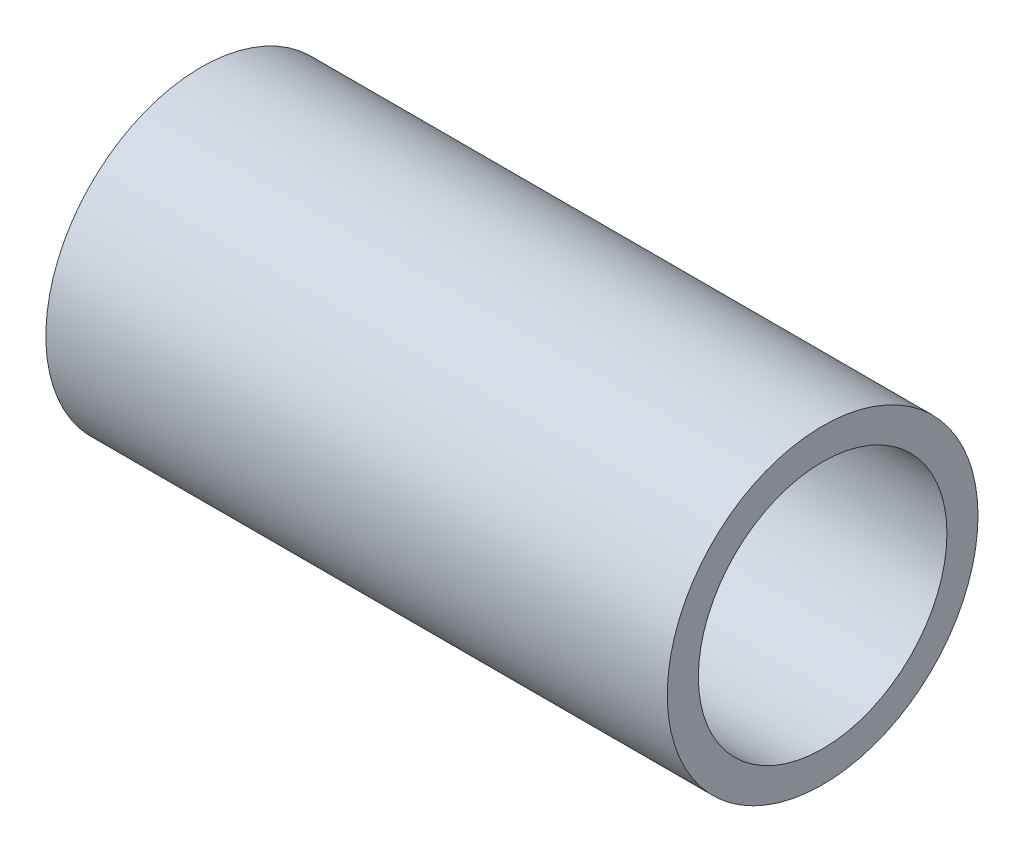
ISO-10303-21;
HEADER;
FILE_DESCRIPTION(('STEP AP214'),'2;1');
FILE_NAME('part.step','',(''),(''),'','','');
FILE_SCHEMA(('AUTOMOTIVE_DESIGN { 1 0 10303 214 1 1 1 1 }'));
ENDSEC;
DATA;
#1=APPLICATION_CONTEXT('core data for automotive mechanical design processes');
#2=APPLICATION_PROTOCOL_DEFINITION('international standard','automotive_design',2000,#1);
#3=PRODUCT_CONTEXT('',#1,'mechanical');
#4=PRODUCT('Part','Part','',(#3));
#5=PRODUCT_RELATED_PRODUCT_CATEGORY('part','',(#4));
#6=PRODUCT_DEFINITION_FORMATION('','',#4);
#7=PRODUCT_DEFINITION_CONTEXT('part definition',#1,'design');
#8=PRODUCT_DEFINITION('design','',#6,#7);
#9=PRODUCT_DEFINITION_SHAPE('','',#8);
#10=(LENGTH_UNIT() NAMED_UNIT(*) SI_UNIT(.MILLI.,.METRE.));
#11=(NAMED_UNIT(*) PLANE_ANGLE_UNIT() SI_UNIT($,.RADIAN.));
#12=(NAMED_UNIT(*) SI_UNIT($,.STERADIAN.) SOLID_ANGLE_UNIT());
#13=UNCERTAINTY_MEASURE_WITH_UNIT(LENGTH_MEASURE(1.E-05),#10,'distance_accuracy_value','');
#14=(GEOMETRIC_REPRESENTATION_CONTEXT(3) GLOBAL_UNCERTAINTY_ASSIGNED_CONTEXT((#13)) GLOBAL_UNIT_ASSIGNED_CONTEXT((#10,
#11,#12)) REPRESENTATION_CONTEXT('',''));
#15=CARTESIAN_POINT('',(0.,0.,0.));
#16=DIRECTION('',(0.,0.,1.));
#17=DIRECTION('',(1.,0.,0.));
#18=AXIS2_PLACEMENT_3D('',#15,#16,#17);
#19=CARTESIAN_POINT('',(31.75,0.,0.));
#20=DIRECTION('',(1.,0.,0.));
#21=DIRECTION('',(0.,0.,-1.));
#22=AXIS2_PLACEMENT_3D('',#19,#20,#21);
#23=PLANE('',#22);
#24=CARTESIAN_POINT('',(31.75,0.,0.));
#25=DIRECTION('',(1.,0.,0.));
#26=DIRECTION('',(0.,0.,-1.));
#27=AXIS2_PLACEMENT_3D('',#24,#25,#26);
#28=CIRCLE('',#27,7.9375);
#29=CARTESIAN_POINT('',(31.75,0.,-7.9375));
#30=VERTEX_POINT('',#29);
#31=EDGE_CURVE('E10',#30,#30,#28,.T.);
#32=ORIENTED_EDGE('',*,*,#31,.T.);
#33=EDGE_LOOP('',(#32));
#34=FACE_BOUND('',#33,.T.);
#35=CARTESIAN_POINT('',(31.75,0.,0.));
#36=DIRECTION('',(1.,0.,0.));
#37=DIRECTION('',(0.,0.,-1.));
#38=AXIS2_PLACEMENT_3D('',#35,#36,#37);
#39=CIRCLE('',#38,6.35);
#40=CARTESIAN_POINT('',(31.75,0.,-6.35));
#41=VERTEX_POINT('',#40);
#42=EDGE_CURVE('E41',#41,#41,#39,.T.);
#43=ORIENTED_EDGE('',*,*,#42,.F.);
#44=EDGE_LOOP('',(#43));
#45=FACE_BOUND('',#44,.T.);
#46=ADVANCED_FACE('F30',(#34,#45),#23,.T.);
#47=CARTESIAN_POINT('',(0.,0.,0.));
#48=DIRECTION('',(1.,0.,0.));
#49=DIRECTION('',(0.,0.,-1.));
#50=AXIS2_PLACEMENT_3D('',#47,#48,#49);
#51=PLANE('',#50);
#52=CARTESIAN_POINT('',(0.,0.,0.));
#53=DIRECTION('',(1.,0.,0.));
#54=DIRECTION('',(0.,0.,-1.));
#55=AXIS2_PLACEMENT_3D('',#52,#53,#54);
#56=CIRCLE('',#55,7.9375);
#57=CARTESIAN_POINT('',(0.,0.,-7.9375));
#58=VERTEX_POINT('',#57);
#59=EDGE_CURVE('E34',#58,#58,#56,.T.);
#60=ORIENTED_EDGE('',*,*,#59,.F.);
#61=EDGE_LOOP('',(#60));
#62=FACE_BOUND('',#61,.T.);
#63=CARTESIAN_POINT('',(0.,0.,0.));
#64=DIRECTION('',(1.,0.,0.));
#65=DIRECTION('',(0.,0.,-1.));
#66=AXIS2_PLACEMENT_3D('',#63,#64,#65);
#67=CIRCLE('',#66,6.35);
#68=CARTESIAN_POINT('',(0.,0.,-6.35));
#69=VERTEX_POINT('',#68);
#70=EDGE_CURVE('E43',#69,#69,#67,.T.);
#71=ORIENTED_EDGE('',*,*,#70,.T.);
#72=EDGE_LOOP('',(#71));
#73=FACE_BOUND('',#72,.T.);
#74=ADVANCED_FACE('F53',(#62,#73),#51,.F.);
#75=CARTESIAN_POINT('',(31.75,0.,0.));
#76=DIRECTION('',(-1.,0.,0.));
#77=DIRECTION('',(0.,0.,1.));
#78=AXIS2_PLACEMENT_3D('',#75,#76,#77);
#79=CYLINDRICAL_SURFACE('',#78,7.9375);
#80=ORIENTED_EDGE('',*,*,#31,.F.);
#81=EDGE_LOOP('',(#80));
#82=FACE_BOUND('',#81,.T.);
#83=ORIENTED_EDGE('',*,*,#59,.T.);
#84=EDGE_LOOP('',(#83));
#85=FACE_BOUND('',#84,.T.);
#86=ADVANCED_FACE('F32',(#82,#85),#79,.T.);
#87=CARTESIAN_POINT('',(31.75,0.,0.));
#88=DIRECTION('',(-1.,0.,0.));
#89=DIRECTION('',(0.,0.,1.));
#90=AXIS2_PLACEMENT_3D('',#87,#88,#89);
#91=CYLINDRICAL_SURFACE('',#90,6.35);
#92=ORIENTED_EDGE('',*,*,#42,.T.);
#93=EDGE_LOOP('',(#92));
#94=FACE_BOUND('',#93,.T.);
#95=ORIENTED_EDGE('',*,*,#70,.F.);
#96=EDGE_LOOP('',(#95));
#97=FACE_BOUND('',#96,.T.);
#98=ADVANCED_FACE('F49',(#94,#97),#91,.F.);
#99=CLOSED_SHELL('',(#46,#74,#86,#98));
#100=MANIFOLD_SOLID_BREP('B2',#99);
#101=ADVANCED_BREP_SHAPE_REPRESENTATION('',(#18,#100),#14);
#102=SHAPE_DEFINITION_REPRESENTATION(#9,#101);
ENDSEC;
END-ISO-10303-21;
